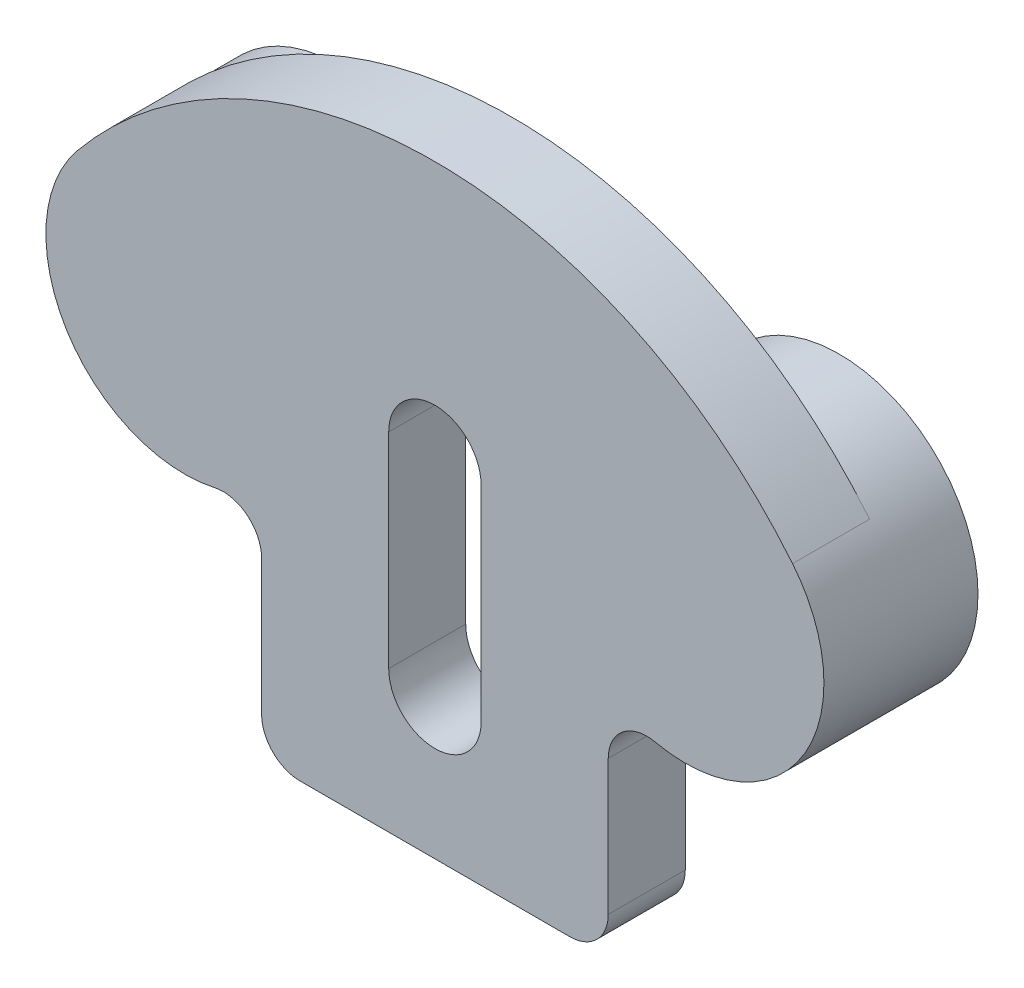
ISO-10303-21;
HEADER;
FILE_DESCRIPTION(('STEP AP214'),'2;1');
FILE_NAME('part.step','',(''),(''),'','','');
FILE_SCHEMA(('AUTOMOTIVE_DESIGN { 1 0 10303 214 1 1 1 1 }'));
ENDSEC;
DATA;
#1=APPLICATION_CONTEXT('core data for automotive mechanical design processes');
#2=APPLICATION_PROTOCOL_DEFINITION('international standard','automotive_design',2000,#1);
#3=PRODUCT_CONTEXT('',#1,'mechanical');
#4=PRODUCT('Part','Part','',(#3));
#5=PRODUCT_RELATED_PRODUCT_CATEGORY('part','',(#4));
#6=PRODUCT_DEFINITION_FORMATION('','',#4);
#7=PRODUCT_DEFINITION_CONTEXT('part definition',#1,'design');
#8=PRODUCT_DEFINITION('design','',#6,#7);
#9=PRODUCT_DEFINITION_SHAPE('','',#8);
#10=(LENGTH_UNIT() NAMED_UNIT(*) SI_UNIT(.MILLI.,.METRE.));
#11=(NAMED_UNIT(*) PLANE_ANGLE_UNIT() SI_UNIT($,.RADIAN.));
#12=(NAMED_UNIT(*) SI_UNIT($,.STERADIAN.) SOLID_ANGLE_UNIT());
#13=UNCERTAINTY_MEASURE_WITH_UNIT(LENGTH_MEASURE(1.E-05),#10,'distance_accuracy_value','');
#14=(GEOMETRIC_REPRESENTATION_CONTEXT(3) GLOBAL_UNCERTAINTY_ASSIGNED_CONTEXT((#13)) GLOBAL_UNIT_ASSIGNED_CONTEXT((#10,
#11,#12)) REPRESENTATION_CONTEXT('',''));
#15=CARTESIAN_POINT('',(0.,0.,0.));
#16=DIRECTION('',(0.,0.,1.));
#17=DIRECTION('',(1.,0.,0.));
#18=AXIS2_PLACEMENT_3D('',#15,#16,#17);
#19=CARTESIAN_POINT('',(-32.5,26.6035711888461,-20.));
#20=DIRECTION('',(0.,0.,1.));
#21=DIRECTION('',(1.,0.,0.));
#22=AXIS2_PLACEMENT_3D('',#19,#20,#21);
#23=CYLINDRICAL_SURFACE('',#22,13.);
#24=CARTESIAN_POINT('',(-32.5,26.6035711888461,-20.));
#25=DIRECTION('',(0.,0.,1.));
#26=DIRECTION('',(1.,0.,0.));
#27=AXIS2_PLACEMENT_3D('',#24,#25,#26);
#28=CIRCLE('',#27,13.);
#29=CARTESIAN_POINT('',(-19.5,26.6035711888461,-20.));
#30=VERTEX_POINT('',#29);
#31=EDGE_CURVE('E345',#30,#30,#28,.T.);
#32=ORIENTED_EDGE('',*,*,#31,.F.);
#33=EDGE_LOOP('',(#32));
#34=FACE_BOUND('',#33,.T.);
#35=CARTESIAN_POINT('',(-32.5,26.6035711888461,-10.));
#36=DIRECTION('',(0.,0.,1.));
#37=DIRECTION('',(1.,0.,0.));
#38=AXIS2_PLACEMENT_3D('',#35,#36,#37);
#39=CIRCLE('',#38,13.);
#40=CARTESIAN_POINT('',(-19.5,26.6035711888461,-10.));
#41=VERTEX_POINT('',#40);
#42=EDGE_CURVE('E12',#41,#41,#39,.F.);
#43=ORIENTED_EDGE('',*,*,#42,.F.);
#44=EDGE_LOOP('',(#43));
#45=FACE_BOUND('',#44,.T.);
#46=ADVANCED_FACE('F103',(#34,#45),#23,.F.);
#47=CARTESIAN_POINT('',(32.5,26.6035711888461,-20.));
#48=DIRECTION('',(0.,0.,1.));
#49=DIRECTION('',(1.,0.,0.));
#50=AXIS2_PLACEMENT_3D('',#47,#48,#49);
#51=CYLINDRICAL_SURFACE('',#50,13.);
#52=CARTESIAN_POINT('',(32.5,26.6035711888461,-20.));
#53=DIRECTION('',(0.,0.,1.));
#54=DIRECTION('',(1.,0.,0.));
#55=AXIS2_PLACEMENT_3D('',#52,#53,#54);
#56=CIRCLE('',#55,13.);
#57=CARTESIAN_POINT('',(45.5,26.6035711888461,-20.));
#58=VERTEX_POINT('',#57);
#59=EDGE_CURVE('E234',#58,#58,#56,.F.);
#60=ORIENTED_EDGE('',*,*,#59,.T.);
#61=EDGE_LOOP('',(#60));
#62=FACE_BOUND('',#61,.T.);
#63=CARTESIAN_POINT('',(32.5,26.6035711888461,-10.));
#64=DIRECTION('',(0.,0.,1.));
#65=DIRECTION('',(1.,0.,0.));
#66=AXIS2_PLACEMENT_3D('',#63,#64,#65);
#67=CIRCLE('',#66,13.);
#68=CARTESIAN_POINT('',(45.5,26.6035711888461,-10.));
#69=VERTEX_POINT('',#68);
#70=EDGE_CURVE('E349',#69,#69,#67,.F.);
#71=ORIENTED_EDGE('',*,*,#70,.F.);
#72=EDGE_LOOP('',(#71));
#73=FACE_BOUND('',#72,.T.);
#74=ADVANCED_FACE('F371',(#62,#73),#51,.F.);
#75=CARTESIAN_POINT('',(27.5,4.1536268682024,-10.));
#76=DIRECTION('',(0.,0.,1.));
#77=DIRECTION('',(1.,0.,0.));
#78=AXIS2_PLACEMENT_3D('',#75,#76,#77);
#79=CYLINDRICAL_SURFACE('',#78,5.);
#80=CARTESIAN_POINT('',(27.5,4.1536268682024,0.));
#81=DIRECTION('',(0.,0.,1.));
#82=DIRECTION('',(1.,0.,0.));
#83=AXIS2_PLACEMENT_3D('',#80,#81,#82);
#84=CIRCLE('',#83,5.);
#85=CARTESIAN_POINT('',(28.5869565217391,9.0340495466032,0.));
#86=VERTEX_POINT('',#85);
#87=CARTESIAN_POINT('',(22.5,4.1536268682024,0.));
#88=VERTEX_POINT('',#87);
#89=EDGE_CURVE('E244',#86,#88,#84,.T.);
#90=ORIENTED_EDGE('',*,*,#89,.T.);
#91=DIRECTION('',(0.,0.,1.));
#92=VECTOR('',#91,1.);
#93=CARTESIAN_POINT('',(22.5,4.1536268682024,-10.));
#94=LINE('',#93,#92);
#95=CARTESIAN_POINT('',(22.5,4.1536268682024,-10.));
#96=VERTEX_POINT('',#95);
#97=EDGE_CURVE('E114',#96,#88,#94,.T.);
#98=ORIENTED_EDGE('',*,*,#97,.F.);
#99=CARTESIAN_POINT('',(27.5,4.1536268682024,-10.));
#100=DIRECTION('',(0.,0.,1.));
#101=DIRECTION('',(1.,0.,0.));
#102=AXIS2_PLACEMENT_3D('',#99,#100,#101);
#103=CIRCLE('',#102,5.);
#104=CARTESIAN_POINT('',(28.5869565217391,9.0340495466032,-10.));
#105=VERTEX_POINT('',#104);
#106=EDGE_CURVE('E301',#105,#96,#103,.T.);
#107=ORIENTED_EDGE('',*,*,#106,.F.);
#108=DIRECTION('',(0.,0.,1.));
#109=VECTOR('',#108,1.);
#110=CARTESIAN_POINT('',(28.5869565217391,9.0340495466032,-10.));
#111=LINE('',#110,#109);
#112=EDGE_CURVE('E277',#105,#86,#111,.T.);
#113=ORIENTED_EDGE('',*,*,#112,.T.);
#114=EDGE_LOOP('',(#90,#98,#107,#113));
#115=FACE_BOUND('',#114,.T.);
#116=ADVANCED_FACE('F378',(#115),#79,.F.);
#117=CARTESIAN_POINT('',(22.5,0.,-10.));
#118=DIRECTION('',(-1.,0.,0.));
#119=DIRECTION('',(0.,-1.,0.));
#120=AXIS2_PLACEMENT_3D('',#117,#118,#119);
#121=PLANE('',#120);
#122=DIRECTION('',(0.,-1.,0.));
#123=VECTOR('',#122,1.);
#124=CARTESIAN_POINT('',(22.5,0.,0.));
#125=LINE('',#124,#123);
#126=CARTESIAN_POINT('',(22.5,-13.3964288111539,0.));
#127=VERTEX_POINT('',#126);
#128=EDGE_CURVE('E162',#88,#127,#125,.T.);
#129=ORIENTED_EDGE('',*,*,#128,.T.);
#130=DIRECTION('',(0.,0.,1.));
#131=VECTOR('',#130,1.);
#132=CARTESIAN_POINT('',(22.5,-13.3964288111539,-10.));
#133=LINE('',#132,#131);
#134=CARTESIAN_POINT('',(22.5,-13.3964288111539,-10.));
#135=VERTEX_POINT('',#134);
#136=EDGE_CURVE('E219',#135,#127,#133,.T.);
#137=ORIENTED_EDGE('',*,*,#136,.F.);
#138=DIRECTION('',(0.,-1.,0.));
#139=VECTOR('',#138,1.);
#140=CARTESIAN_POINT('',(22.5,0.,-10.));
#141=LINE('',#140,#139);
#142=EDGE_CURVE('E122',#96,#135,#141,.T.);
#143=ORIENTED_EDGE('',*,*,#142,.F.);
#144=ORIENTED_EDGE('',*,*,#97,.T.);
#145=EDGE_LOOP('',(#129,#137,#143,#144));
#146=FACE_BOUND('',#145,.T.);
#147=ADVANCED_FACE('F421',(#146),#121,.F.);
#148=CARTESIAN_POINT('',(17.5,-13.3964288111539,-10.));
#149=DIRECTION('',(0.,0.,1.));
#150=DIRECTION('',(1.,0.,0.));
#151=AXIS2_PLACEMENT_3D('',#148,#149,#150);
#152=CYLINDRICAL_SURFACE('',#151,5.);
#153=CARTESIAN_POINT('',(17.5,-13.3964288111539,0.));
#154=DIRECTION('',(0.,0.,1.));
#155=DIRECTION('',(1.,0.,0.));
#156=AXIS2_PLACEMENT_3D('',#153,#154,#155);
#157=CIRCLE('',#156,5.);
#158=CARTESIAN_POINT('',(17.5,-18.3964288111539,0.));
#159=VERTEX_POINT('',#158);
#160=EDGE_CURVE('E214',#127,#159,#157,.F.);
#161=ORIENTED_EDGE('',*,*,#160,.T.);
#162=DIRECTION('',(0.,0.,1.));
#163=VECTOR('',#162,1.);
#164=CARTESIAN_POINT('',(17.5,-18.3964288111539,-10.));
#165=LINE('',#164,#163);
#166=CARTESIAN_POINT('',(17.5,-18.3964288111539,-10.));
#167=VERTEX_POINT('',#166);
#168=EDGE_CURVE('E211',#167,#159,#165,.T.);
#169=ORIENTED_EDGE('',*,*,#168,.F.);
#170=CARTESIAN_POINT('',(17.5,-13.3964288111539,-10.));
#171=DIRECTION('',(0.,0.,1.));
#172=DIRECTION('',(1.,0.,0.));
#173=AXIS2_PLACEMENT_3D('',#170,#171,#172);
#174=CIRCLE('',#173,5.);
#175=EDGE_CURVE('E201',#135,#167,#174,.F.);
#176=ORIENTED_EDGE('',*,*,#175,.F.);
#177=ORIENTED_EDGE('',*,*,#136,.T.);
#178=EDGE_LOOP('',(#161,#169,#176,#177));
#179=FACE_BOUND('',#178,.T.);
#180=ADVANCED_FACE('F215',(#179),#152,.T.);
#181=CARTESIAN_POINT('',(0.,-18.3964288111539,-10.));
#182=DIRECTION('',(0.,-1.,0.));
#183=DIRECTION('',(0.,0.,-1.));
#184=AXIS2_PLACEMENT_3D('',#181,#182,#183);
#185=PLANE('',#184);
#186=DIRECTION('',(1.,0.,0.));
#187=VECTOR('',#186,1.);
#188=CARTESIAN_POINT('',(0.,-18.3964288111539,0.));
#189=LINE('',#188,#187);
#190=CARTESIAN_POINT('',(-17.5,-18.3964288111539,0.));
#191=VERTEX_POINT('',#190);
#192=EDGE_CURVE('E257',#191,#159,#189,.T.);
#193=ORIENTED_EDGE('',*,*,#192,.F.);
#194=DIRECTION('',(0.,0.,1.));
#195=VECTOR('',#194,1.);
#196=CARTESIAN_POINT('',(-17.5,-18.3964288111539,-10.));
#197=LINE('',#196,#195);
#198=CARTESIAN_POINT('',(-17.5,-18.3964288111539,-10.));
#199=VERTEX_POINT('',#198);
#200=EDGE_CURVE('E217',#199,#191,#197,.T.);
#201=ORIENTED_EDGE('',*,*,#200,.F.);
#202=DIRECTION('',(1.,0.,0.));
#203=VECTOR('',#202,1.);
#204=CARTESIAN_POINT('',(0.,-18.3964288111539,-10.));
#205=LINE('',#204,#203);
#206=EDGE_CURVE('E210',#199,#167,#205,.T.);
#207=ORIENTED_EDGE('',*,*,#206,.T.);
#208=ORIENTED_EDGE('',*,*,#168,.T.);
#209=EDGE_LOOP('',(#193,#201,#207,#208));
#210=FACE_BOUND('',#209,.T.);
#211=ADVANCED_FACE('F225',(#210),#185,.T.);
#212=CARTESIAN_POINT('',(-17.5,-13.3964288111539,-10.));
#213=DIRECTION('',(0.,0.,1.));
#214=DIRECTION('',(1.,0.,0.));
#215=AXIS2_PLACEMENT_3D('',#212,#213,#214);
#216=CYLINDRICAL_SURFACE('',#215,5.);
#217=CARTESIAN_POINT('',(-17.5,-13.3964288111539,0.));
#218=DIRECTION('',(0.,0.,1.));
#219=DIRECTION('',(1.,0.,0.));
#220=AXIS2_PLACEMENT_3D('',#217,#218,#219);
#221=CIRCLE('',#220,5.);
#222=CARTESIAN_POINT('',(-22.5,-13.3964288111539,0.));
#223=VERTEX_POINT('',#222);
#224=EDGE_CURVE('E251',#223,#191,#221,.T.);
#225=ORIENTED_EDGE('',*,*,#224,.F.);
#226=DIRECTION('',(0.,0.,1.));
#227=VECTOR('',#226,1.);
#228=CARTESIAN_POINT('',(-22.5,-13.3964288111539,-10.));
#229=LINE('',#228,#227);
#230=CARTESIAN_POINT('',(-22.5,-13.3964288111539,-10.));
#231=VERTEX_POINT('',#230);
#232=EDGE_CURVE('E262',#231,#223,#229,.T.);
#233=ORIENTED_EDGE('',*,*,#232,.F.);
#234=CARTESIAN_POINT('',(-17.5,-13.3964288111539,-10.));
#235=DIRECTION('',(0.,0.,1.));
#236=DIRECTION('',(1.,0.,0.));
#237=AXIS2_PLACEMENT_3D('',#234,#235,#236);
#238=CIRCLE('',#237,5.);
#239=EDGE_CURVE('E223',#231,#199,#238,.T.);
#240=ORIENTED_EDGE('',*,*,#239,.T.);
#241=ORIENTED_EDGE('',*,*,#200,.T.);
#242=EDGE_LOOP('',(#225,#233,#240,#241));
#243=FACE_BOUND('',#242,.T.);
#244=ADVANCED_FACE('F557',(#243),#216,.T.);
#245=CARTESIAN_POINT('',(-22.5,0.,-10.));
#246=DIRECTION('',(-1.,0.,0.));
#247=DIRECTION('',(0.,-1.,0.));
#248=AXIS2_PLACEMENT_3D('',#245,#246,#247);
#249=PLANE('',#248);
#250=DIRECTION('',(0.,-1.,0.));
#251=VECTOR('',#250,1.);
#252=CARTESIAN_POINT('',(-22.5,0.,0.));
#253=LINE('',#252,#251);
#254=CARTESIAN_POINT('',(-22.5,4.1536268682024,0.));
#255=VERTEX_POINT('',#254);
#256=EDGE_CURVE('E252',#255,#223,#253,.T.);
#257=ORIENTED_EDGE('',*,*,#256,.F.);
#258=DIRECTION('',(0.,0.,1.));
#259=VECTOR('',#258,1.);
#260=CARTESIAN_POINT('',(-22.5,4.1536268682024,-10.));
#261=LINE('',#260,#259);
#262=CARTESIAN_POINT('',(-22.5,4.1536268682024,-10.));
#263=VERTEX_POINT('',#262);
#264=EDGE_CURVE('E270',#263,#255,#261,.T.);
#265=ORIENTED_EDGE('',*,*,#264,.F.);
#266=DIRECTION('',(0.,-1.,0.));
#267=VECTOR('',#266,1.);
#268=CARTESIAN_POINT('',(-22.5,0.,-10.));
#269=LINE('',#268,#267);
#270=EDGE_CURVE('E224',#263,#231,#269,.T.);
#271=ORIENTED_EDGE('',*,*,#270,.T.);
#272=ORIENTED_EDGE('',*,*,#232,.T.);
#273=EDGE_LOOP('',(#257,#265,#271,#272));
#274=FACE_BOUND('',#273,.T.);
#275=ADVANCED_FACE('F324',(#274),#249,.T.);
#276=CARTESIAN_POINT('',(-27.5,4.1536268682024,-10.));
#277=DIRECTION('',(0.,0.,1.));
#278=DIRECTION('',(1.,0.,0.));
#279=AXIS2_PLACEMENT_3D('',#276,#277,#278);
#280=CYLINDRICAL_SURFACE('',#279,5.);
#281=CARTESIAN_POINT('',(-27.5,4.1536268682024,0.));
#282=DIRECTION('',(0.,0.,1.));
#283=DIRECTION('',(1.,0.,0.));
#284=AXIS2_PLACEMENT_3D('',#281,#282,#283);
#285=CIRCLE('',#284,5.);
#286=CARTESIAN_POINT('',(-28.5869565217391,9.0340495466032,0.));
#287=VERTEX_POINT('',#286);
#288=EDGE_CURVE('E246',#287,#255,#285,.F.);
#289=ORIENTED_EDGE('',*,*,#288,.F.);
#290=DIRECTION('',(0.,0.,1.));
#291=VECTOR('',#290,1.);
#292=CARTESIAN_POINT('',(-28.5869565217391,9.0340495466032,-10.));
#293=LINE('',#292,#291);
#294=CARTESIAN_POINT('',(-28.5869565217391,9.0340495466032,-10.));
#295=VERTEX_POINT('',#294);
#296=EDGE_CURVE('E267',#295,#287,#293,.T.);
#297=ORIENTED_EDGE('',*,*,#296,.F.);
#298=CARTESIAN_POINT('',(-27.5,4.1536268682024,-10.));
#299=DIRECTION('',(0.,0.,1.));
#300=DIRECTION('',(1.,0.,0.));
#301=AXIS2_PLACEMENT_3D('',#298,#299,#300);
#302=CIRCLE('',#301,5.);
#303=EDGE_CURVE('E317',#295,#263,#302,.F.);
#304=ORIENTED_EDGE('',*,*,#303,.T.);
#305=ORIENTED_EDGE('',*,*,#264,.T.);
#306=EDGE_LOOP('',(#289,#297,#304,#305));
#307=FACE_BOUND('',#306,.T.);
#308=ADVANCED_FACE('F334',(#307),#280,.F.);
#309=CARTESIAN_POINT('',(0.,0.,-10.));
#310=DIRECTION('',(0.,0.,1.));
#311=DIRECTION('',(1.,0.,0.));
#312=AXIS2_PLACEMENT_3D('',#309,#310,#311);
#313=CYLINDRICAL_SURFACE('',#312,60.);
#314=CARTESIAN_POINT('',(0.,0.,0.));
#315=DIRECTION('',(0.,0.,1.));
#316=DIRECTION('',(1.,0.,0.));
#317=AXIS2_PLACEMENT_3D('',#314,#315,#316);
#318=CIRCLE('',#317,60.);
#319=CARTESIAN_POINT('',(46.4285714285714,38.0051016983515,0.));
#320=VERTEX_POINT('',#319);
#321=CARTESIAN_POINT('',(-46.4285714285714,38.0051016983515,0.));
#322=VERTEX_POINT('',#321);
#323=EDGE_CURVE('E243',#320,#322,#318,.T.);
#324=ORIENTED_EDGE('',*,*,#323,.F.);
#325=DIRECTION('',(0.,0.,1.));
#326=VECTOR('',#325,1.);
#327=CARTESIAN_POINT('',(46.4285714285714,38.0051016983515,-10.));
#328=LINE('',#327,#326);
#329=CARTESIAN_POINT('',(46.4285714285714,38.0051016983515,-10.));
#330=VERTEX_POINT('',#329);
#331=EDGE_CURVE('E274',#330,#320,#328,.T.);
#332=ORIENTED_EDGE('',*,*,#331,.F.);
#333=CARTESIAN_POINT('',(0.,0.,-10.));
#334=DIRECTION('',(0.,0.,1.));
#335=DIRECTION('',(1.,0.,0.));
#336=AXIS2_PLACEMENT_3D('',#333,#334,#335);
#337=CIRCLE('',#336,60.);
#338=CARTESIAN_POINT('',(-46.4285714285714,38.0051016983515,-10.));
#339=VERTEX_POINT('',#338);
#340=EDGE_CURVE('E313',#330,#339,#337,.T.);
#341=ORIENTED_EDGE('',*,*,#340,.T.);
#342=DIRECTION('',(0.,0.,1.));
#343=VECTOR('',#342,1.);
#344=CARTESIAN_POINT('',(-46.4285714285714,38.0051016983515,-10.));
#345=LINE('',#344,#343);
#346=EDGE_CURVE('E275',#339,#322,#345,.T.);
#347=ORIENTED_EDGE('',*,*,#346,.T.);
#348=EDGE_LOOP('',(#324,#332,#341,#347));
#349=FACE_BOUND('',#348,.T.);
#350=ADVANCED_FACE('F415',(#349),#313,.T.);
#351=CARTESIAN_POINT('',(0.,26.6035711888461,-10.));
#352=DIRECTION('',(0.,0.,1.));
#353=DIRECTION('',(1.,0.,0.));
#354=AXIS2_PLACEMENT_3D('',#351,#352,#353);
#355=CYLINDRICAL_SURFACE('',#354,5.99999999999999);
#356=CARTESIAN_POINT('',(0.,26.6035711888461,0.));
#357=DIRECTION('',(0.,0.,1.));
#358=DIRECTION('',(1.,0.,0.));
#359=AXIS2_PLACEMENT_3D('',#356,#357,#358);
#360=CIRCLE('',#359,5.99999999999999);
#361=CARTESIAN_POINT('',(5.99999999999999,26.6035711888461,0.));
#362=VERTEX_POINT('',#361);
#363=CARTESIAN_POINT('',(-5.99999999999999,26.6035711888461,0.));
#364=VERTEX_POINT('',#363);
#365=EDGE_CURVE('E231',#362,#364,#360,.T.);
#366=ORIENTED_EDGE('',*,*,#365,.T.);
#367=DIRECTION('',(0.,0.,1.));
#368=VECTOR('',#367,1.);
#369=CARTESIAN_POINT('',(-5.99999999999999,26.6035711888461,-10.));
#370=LINE('',#369,#368);
#371=CARTESIAN_POINT('',(-5.99999999999999,26.6035711888461,-10.));
#372=VERTEX_POINT('',#371);
#373=EDGE_CURVE('E279',#372,#364,#370,.T.);
#374=ORIENTED_EDGE('',*,*,#373,.F.);
#375=CARTESIAN_POINT('',(0.,26.6035711888461,-10.));
#376=DIRECTION('',(0.,0.,1.));
#377=DIRECTION('',(1.,0.,0.));
#378=AXIS2_PLACEMENT_3D('',#375,#376,#377);
#379=CIRCLE('',#378,5.99999999999999);
#380=CARTESIAN_POINT('',(5.99999999999999,26.6035711888461,-10.));
#381=VERTEX_POINT('',#380);
#382=EDGE_CURVE('E263',#381,#372,#379,.T.);
#383=ORIENTED_EDGE('',*,*,#382,.F.);
#384=DIRECTION('',(0.,0.,1.));
#385=VECTOR('',#384,1.);
#386=CARTESIAN_POINT('',(5.99999999999999,26.6035711888461,-10.));
#387=LINE('',#386,#385);
#388=EDGE_CURVE('E229',#381,#362,#387,.T.);
#389=ORIENTED_EDGE('',*,*,#388,.T.);
#390=EDGE_LOOP('',(#366,#374,#383,#389));
#391=FACE_BOUND('',#390,.T.);
#392=ADVANCED_FACE('F109',(#391),#355,.F.);
#393=CARTESIAN_POINT('',(-6.,0.,-10.));
#394=DIRECTION('',(1.,0.,0.));
#395=DIRECTION('',(0.,1.,0.));
#396=AXIS2_PLACEMENT_3D('',#393,#394,#395);
#397=PLANE('',#396);
#398=DIRECTION('',(0.,1.,0.));
#399=VECTOR('',#398,1.);
#400=CARTESIAN_POINT('',(-6.,0.,0.));
#401=LINE('',#400,#399);
#402=CARTESIAN_POINT('',(-6.,0.,0.));
#403=VERTEX_POINT('',#402);
#404=EDGE_CURVE('E236',#403,#364,#401,.T.);
#405=ORIENTED_EDGE('',*,*,#404,.F.);
#406=DIRECTION('',(0.,0.,1.));
#407=VECTOR('',#406,1.);
#408=CARTESIAN_POINT('',(-6.,0.,-10.));
#409=LINE('',#408,#407);
#410=CARTESIAN_POINT('',(-6.,0.,-10.));
#411=VERTEX_POINT('',#410);
#412=EDGE_CURVE('E285',#411,#403,#409,.T.);
#413=ORIENTED_EDGE('',*,*,#412,.F.);
#414=DIRECTION('',(0.,1.,0.));
#415=VECTOR('',#414,1.);
#416=CARTESIAN_POINT('',(-6.,0.,-10.));
#417=LINE('',#416,#415);
#418=EDGE_CURVE('E302',#411,#372,#417,.T.);
#419=ORIENTED_EDGE('',*,*,#418,.T.);
#420=ORIENTED_EDGE('',*,*,#373,.T.);
#421=EDGE_LOOP('',(#405,#413,#419,#420));
#422=FACE_BOUND('',#421,.T.);
#423=ADVANCED_FACE('F300',(#422),#397,.T.);
#424=CARTESIAN_POINT('',(0.,0.,-10.));
#425=DIRECTION('',(0.,0.,1.));
#426=DIRECTION('',(1.,0.,0.));
#427=AXIS2_PLACEMENT_3D('',#424,#425,#426);
#428=CYLINDRICAL_SURFACE('',#427,6.);
#429=CARTESIAN_POINT('',(0.,0.,0.));
#430=DIRECTION('',(0.,0.,1.));
#431=DIRECTION('',(1.,0.,0.));
#432=AXIS2_PLACEMENT_3D('',#429,#430,#431);
#433=CIRCLE('',#432,6.);
#434=CARTESIAN_POINT('',(6.,0.,0.));
#435=VERTEX_POINT('',#434);
#436=EDGE_CURVE('E240',#403,#435,#433,.T.);
#437=ORIENTED_EDGE('',*,*,#436,.T.);
#438=DIRECTION('',(0.,0.,1.));
#439=VECTOR('',#438,1.);
#440=CARTESIAN_POINT('',(6.,0.,-10.));
#441=LINE('',#440,#439);
#442=CARTESIAN_POINT('',(6.,0.,-10.));
#443=VERTEX_POINT('',#442);
#444=EDGE_CURVE('E281',#443,#435,#441,.T.);
#445=ORIENTED_EDGE('',*,*,#444,.F.);
#446=CARTESIAN_POINT('',(0.,0.,-10.));
#447=DIRECTION('',(0.,0.,1.));
#448=DIRECTION('',(1.,0.,0.));
#449=AXIS2_PLACEMENT_3D('',#446,#447,#448);
#450=CIRCLE('',#449,6.);
#451=EDGE_CURVE('E305',#411,#443,#450,.T.);
#452=ORIENTED_EDGE('',*,*,#451,.F.);
#453=ORIENTED_EDGE('',*,*,#412,.T.);
#454=EDGE_LOOP('',(#437,#445,#452,#453));
#455=FACE_BOUND('',#454,.T.);
#456=ADVANCED_FACE('F372',(#455),#428,.F.);
#457=CARTESIAN_POINT('',(6.,0.,-10.));
#458=DIRECTION('',(1.,0.,0.));
#459=DIRECTION('',(0.,1.,0.));
#460=AXIS2_PLACEMENT_3D('',#457,#458,#459);
#461=PLANE('',#460);
#462=DIRECTION('',(0.,1.,0.));
#463=VECTOR('',#462,1.);
#464=CARTESIAN_POINT('',(6.,0.,0.));
#465=LINE('',#464,#463);
#466=EDGE_CURVE('E233',#435,#362,#465,.T.);
#467=ORIENTED_EDGE('',*,*,#466,.T.);
#468=ORIENTED_EDGE('',*,*,#388,.F.);
#469=DIRECTION('',(0.,1.,0.));
#470=VECTOR('',#469,1.);
#471=CARTESIAN_POINT('',(6.,0.,-10.));
#472=LINE('',#471,#470);
#473=EDGE_CURVE('E174',#443,#381,#472,.T.);
#474=ORIENTED_EDGE('',*,*,#473,.F.);
#475=ORIENTED_EDGE('',*,*,#444,.T.);
#476=EDGE_LOOP('',(#467,#468,#474,#475));
#477=FACE_BOUND('',#476,.T.);
#478=ADVANCED_FACE('F365',(#477),#461,.F.);
#479=CARTESIAN_POINT('',(0.,0.,-10.));
#480=DIRECTION('',(0.,0.,1.));
#481=DIRECTION('',(1.,0.,0.));
#482=AXIS2_PLACEMENT_3D('',#479,#480,#481);
#483=PLANE('',#482);
#484=ORIENTED_EDGE('',*,*,#382,.T.);
#485=ORIENTED_EDGE('',*,*,#418,.F.);
#486=ORIENTED_EDGE('',*,*,#451,.T.);
#487=ORIENTED_EDGE('',*,*,#473,.T.);
#488=EDGE_LOOP('',(#484,#485,#486,#487));
#489=FACE_BOUND('',#488,.T.);
#490=ORIENTED_EDGE('',*,*,#106,.T.);
#491=ORIENTED_EDGE('',*,*,#142,.T.);
#492=ORIENTED_EDGE('',*,*,#175,.T.);
#493=ORIENTED_EDGE('',*,*,#206,.F.);
#494=ORIENTED_EDGE('',*,*,#239,.F.);
#495=ORIENTED_EDGE('',*,*,#270,.F.);
#496=ORIENTED_EDGE('',*,*,#303,.F.);
#497=CARTESIAN_POINT('',(-32.5,26.6035711888461,-10.));
#498=DIRECTION('',(0.,0.,1.));
#499=DIRECTION('',(1.,0.,0.));
#500=AXIS2_PLACEMENT_3D('',#497,#498,#499);
#501=CIRCLE('',#500,18.);
#502=EDGE_CURVE('E316',#295,#339,#501,.T.);
#503=ORIENTED_EDGE('',*,*,#502,.T.);
#504=ORIENTED_EDGE('',*,*,#340,.F.);
#505=CARTESIAN_POINT('',(32.5,26.6035711888461,-10.));
#506=DIRECTION('',(0.,0.,1.));
#507=DIRECTION('',(1.,0.,0.));
#508=AXIS2_PLACEMENT_3D('',#505,#506,#507);
#509=CIRCLE('',#508,18.);
#510=EDGE_CURVE('E308',#105,#330,#509,.F.);
#511=ORIENTED_EDGE('',*,*,#510,.F.);
#512=EDGE_LOOP('',(#490,#491,#492,#493,#494,#495,#496,#503,#504,#511));
#513=FACE_BOUND('',#512,.T.);
#514=ADVANCED_FACE('F203',(#489,#513),#483,.F.);
#515=CARTESIAN_POINT('',(0.,0.,0.));
#516=DIRECTION('',(0.,0.,1.));
#517=DIRECTION('',(1.,0.,0.));
#518=AXIS2_PLACEMENT_3D('',#515,#516,#517);
#519=PLANE('',#518);
#520=ORIENTED_EDGE('',*,*,#365,.F.);
#521=ORIENTED_EDGE('',*,*,#466,.F.);
#522=ORIENTED_EDGE('',*,*,#436,.F.);
#523=ORIENTED_EDGE('',*,*,#404,.T.);
#524=EDGE_LOOP('',(#520,#521,#522,#523));
#525=FACE_BOUND('',#524,.T.);
#526=ORIENTED_EDGE('',*,*,#89,.F.);
#527=CARTESIAN_POINT('',(32.5,26.6035711888461,0.));
#528=DIRECTION('',(0.,0.,1.));
#529=DIRECTION('',(1.,0.,0.));
#530=AXIS2_PLACEMENT_3D('',#527,#528,#529);
#531=CIRCLE('',#530,18.);
#532=EDGE_CURVE('E351',#320,#86,#531,.F.);
#533=ORIENTED_EDGE('',*,*,#532,.F.);
#534=ORIENTED_EDGE('',*,*,#323,.T.);
#535=CARTESIAN_POINT('',(-32.5,26.6035711888461,0.));
#536=DIRECTION('',(0.,0.,1.));
#537=DIRECTION('',(1.,0.,0.));
#538=AXIS2_PLACEMENT_3D('',#535,#536,#537);
#539=CIRCLE('',#538,18.);
#540=EDGE_CURVE('E338',#322,#287,#539,.T.);
#541=ORIENTED_EDGE('',*,*,#540,.T.);
#542=ORIENTED_EDGE('',*,*,#288,.T.);
#543=ORIENTED_EDGE('',*,*,#256,.T.);
#544=ORIENTED_EDGE('',*,*,#224,.T.);
#545=ORIENTED_EDGE('',*,*,#192,.T.);
#546=ORIENTED_EDGE('',*,*,#160,.F.);
#547=ORIENTED_EDGE('',*,*,#128,.F.);
#548=EDGE_LOOP('',(#526,#533,#534,#541,#542,#543,#544,#545,#546,#547));
#549=FACE_BOUND('',#548,.T.);
#550=ADVANCED_FACE('F294',(#525,#549),#519,.T.);
#551=CARTESIAN_POINT('',(32.5,26.6035711888461,-20.));
#552=DIRECTION('',(0.,0.,1.));
#553=DIRECTION('',(1.,0.,0.));
#554=AXIS2_PLACEMENT_3D('',#551,#552,#553);
#555=CYLINDRICAL_SURFACE('',#554,18.);
#556=ORIENTED_EDGE('',*,*,#112,.F.);
#557=ORIENTED_EDGE('',*,*,#510,.T.);
#558=ORIENTED_EDGE('',*,*,#331,.T.);
#559=ORIENTED_EDGE('',*,*,#532,.T.);
#560=EDGE_LOOP('',(#556,#557,#558,#559));
#561=FACE_BOUND('',#560,.T.);
#562=CARTESIAN_POINT('',(32.5,26.6035711888461,-20.));
#563=DIRECTION('',(0.,0.,1.));
#564=DIRECTION('',(1.,0.,0.));
#565=AXIS2_PLACEMENT_3D('',#562,#563,#564);
#566=CIRCLE('',#565,18.);
#567=CARTESIAN_POINT('',(50.5,26.6035711888461,-20.));
#568=VERTEX_POINT('',#567);
#569=EDGE_CURVE('E354',#568,#568,#566,.F.);
#570=ORIENTED_EDGE('',*,*,#569,.F.);
#571=EDGE_LOOP('',(#570));
#572=FACE_BOUND('',#571,.T.);
#573=ADVANCED_FACE('F367',(#561,#572),#555,.T.);
#574=CARTESIAN_POINT('',(0.,0.,-20.));
#575=DIRECTION('',(0.,0.,1.));
#576=DIRECTION('',(1.,0.,0.));
#577=AXIS2_PLACEMENT_3D('',#574,#575,#576);
#578=PLANE('',#577);
#579=ORIENTED_EDGE('',*,*,#569,.T.);
#580=EDGE_LOOP('',(#579));
#581=FACE_BOUND('',#580,.T.);
#582=ORIENTED_EDGE('',*,*,#59,.F.);
#583=EDGE_LOOP('',(#582));
#584=FACE_BOUND('',#583,.T.);
#585=ADVANCED_FACE('F393',(#581,#584),#578,.F.);
#586=CARTESIAN_POINT('',(0.,0.,-10.));
#587=DIRECTION('',(0.,0.,1.));
#588=DIRECTION('',(1.,0.,0.));
#589=AXIS2_PLACEMENT_3D('',#586,#587,#588);
#590=PLANE('',#589);
#591=ORIENTED_EDGE('',*,*,#70,.T.);
#592=EDGE_LOOP('',(#591));
#593=FACE_BOUND('',#592,.T.);
#594=ADVANCED_FACE('F390',(#593),#590,.F.);
#595=CARTESIAN_POINT('',(-32.5,26.6035711888461,-20.));
#596=DIRECTION('',(0.,0.,1.));
#597=DIRECTION('',(1.,0.,0.));
#598=AXIS2_PLACEMENT_3D('',#595,#596,#597);
#599=CYLINDRICAL_SURFACE('',#598,18.);
#600=CARTESIAN_POINT('',(-32.5,26.6035711888461,-20.));
#601=DIRECTION('',(0.,0.,1.));
#602=DIRECTION('',(1.,0.,0.));
#603=AXIS2_PLACEMENT_3D('',#600,#601,#602);
#604=CIRCLE('',#603,18.);
#605=CARTESIAN_POINT('',(-14.5,26.6035711888461,-20.));
#606=VERTEX_POINT('',#605);
#607=EDGE_CURVE('E348',#606,#606,#604,.T.);
#608=ORIENTED_EDGE('',*,*,#607,.T.);
#609=EDGE_LOOP('',(#608));
#610=FACE_BOUND('',#609,.T.);
#611=ORIENTED_EDGE('',*,*,#346,.F.);
#612=ORIENTED_EDGE('',*,*,#502,.F.);
#613=ORIENTED_EDGE('',*,*,#296,.T.);
#614=ORIENTED_EDGE('',*,*,#540,.F.);
#615=EDGE_LOOP('',(#611,#612,#613,#614));
#616=FACE_BOUND('',#615,.T.);
#617=ADVANCED_FACE('F336',(#610,#616),#599,.T.);
#618=CARTESIAN_POINT('',(0.,0.,-20.));
#619=DIRECTION('',(0.,0.,1.));
#620=DIRECTION('',(1.,0.,0.));
#621=AXIS2_PLACEMENT_3D('',#618,#619,#620);
#622=PLANE('',#621);
#623=ORIENTED_EDGE('',*,*,#31,.T.);
#624=EDGE_LOOP('',(#623));
#625=FACE_BOUND('',#624,.T.);
#626=ORIENTED_EDGE('',*,*,#607,.F.);
#627=EDGE_LOOP('',(#626));
#628=FACE_BOUND('',#627,.T.);
#629=ADVANCED_FACE('F466',(#625,#628),#622,.F.);
#630=CARTESIAN_POINT('',(0.,0.,-10.));
#631=DIRECTION('',(0.,0.,1.));
#632=DIRECTION('',(1.,0.,0.));
#633=AXIS2_PLACEMENT_3D('',#630,#631,#632);
#634=PLANE('',#633);
#635=ORIENTED_EDGE('',*,*,#42,.T.);
#636=EDGE_LOOP('',(#635));
#637=FACE_BOUND('',#636,.T.);
#638=ADVANCED_FACE('F463',(#637),#634,.F.);
#639=CLOSED_SHELL('',(#46,#74,#116,#147,#180,#211,#244,#275,#308,#350,#392,#423,#456,#478,#514,
#550,#573,#585,#594,#617,#629,#638));
#640=MANIFOLD_SOLID_BREP('B2',#639);
#641=ADVANCED_BREP_SHAPE_REPRESENTATION('',(#18,#640),#14);
#642=SHAPE_DEFINITION_REPRESENTATION(#9,#641);
ENDSEC;
END-ISO-10303-21;
